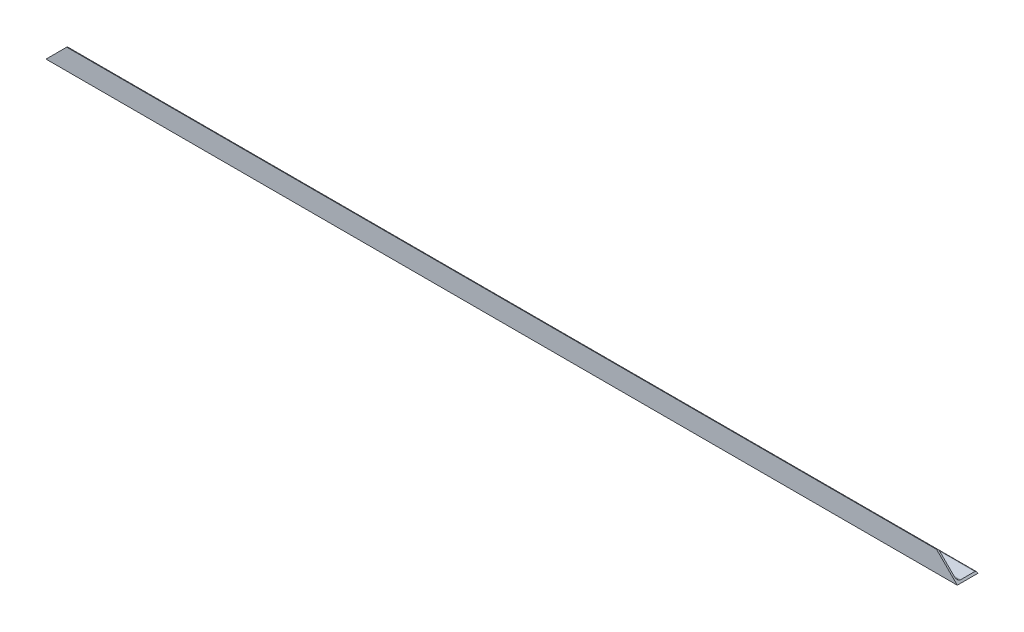
ISO-10303-21;
HEADER;
FILE_DESCRIPTION(('STEP AP214'),'2;1');
FILE_NAME('part.step','',(''),(''),'','','');
FILE_SCHEMA(('AUTOMOTIVE_DESIGN { 1 0 10303 214 1 1 1 1 }'));
ENDSEC;
DATA;
#1=APPLICATION_CONTEXT('core data for automotive mechanical design processes');
#2=APPLICATION_PROTOCOL_DEFINITION('international standard','automotive_design',2000,#1);
#3=PRODUCT_CONTEXT('',#1,'mechanical');
#4=PRODUCT('Part','Part','',(#3));
#5=PRODUCT_RELATED_PRODUCT_CATEGORY('part','',(#4));
#6=PRODUCT_DEFINITION_FORMATION('','',#4);
#7=PRODUCT_DEFINITION_CONTEXT('part definition',#1,'design');
#8=PRODUCT_DEFINITION('design','',#6,#7);
#9=PRODUCT_DEFINITION_SHAPE('','',#8);
#10=(LENGTH_UNIT() NAMED_UNIT(*) SI_UNIT(.MILLI.,.METRE.));
#11=(NAMED_UNIT(*) PLANE_ANGLE_UNIT() SI_UNIT($,.RADIAN.));
#12=(NAMED_UNIT(*) SI_UNIT($,.STERADIAN.) SOLID_ANGLE_UNIT());
#13=UNCERTAINTY_MEASURE_WITH_UNIT(LENGTH_MEASURE(1.E-05),#10,'distance_accuracy_value','');
#14=(GEOMETRIC_REPRESENTATION_CONTEXT(3) GLOBAL_UNCERTAINTY_ASSIGNED_CONTEXT((#13)) GLOBAL_UNIT_ASSIGNED_CONTEXT((#10,
#11,#12)) REPRESENTATION_CONTEXT('',''));
#15=CARTESIAN_POINT('',(0.,0.,0.));
#16=DIRECTION('',(0.,0.,1.));
#17=DIRECTION('',(1.,0.,0.));
#18=AXIS2_PLACEMENT_3D('',#15,#16,#17);
#19=CARTESIAN_POINT('',(1760.,0.,-40.));
#20=DIRECTION('',(0.,1.,0.));
#21=DIRECTION('',(0.,0.,1.));
#22=AXIS2_PLACEMENT_3D('',#19,#20,#21);
#23=PLANE('',#22);
#24=DIRECTION('',(0.,0.,-1.));
#25=VECTOR('',#24,1.);
#26=CARTESIAN_POINT('',(0.,0.,-40.));
#27=LINE('',#26,#25);
#28=CARTESIAN_POINT('',(0.,0.,0.));
#29=VERTEX_POINT('',#28);
#30=CARTESIAN_POINT('',(0.,0.,-40.));
#31=VERTEX_POINT('',#30);
#32=EDGE_CURVE('E113',#29,#31,#27,.T.);
#33=ORIENTED_EDGE('',*,*,#32,.T.);
#34=DIRECTION('',(-1.,0.,0.));
#35=VECTOR('',#34,1.);
#36=CARTESIAN_POINT('',(1760.,0.,-40.));
#37=LINE('',#36,#35);
#38=CARTESIAN_POINT('',(1760.,0.,-40.));
#39=VERTEX_POINT('',#38);
#40=EDGE_CURVE('E13',#39,#31,#37,.T.);
#41=ORIENTED_EDGE('',*,*,#40,.F.);
#42=DIRECTION('',(0.,0.,-1.));
#43=VECTOR('',#42,1.);
#44=CARTESIAN_POINT('',(1760.,0.,-40.));
#45=LINE('',#44,#43);
#46=CARTESIAN_POINT('',(1760.,0.,0.));
#47=VERTEX_POINT('',#46);
#48=EDGE_CURVE('E123',#47,#39,#45,.T.);
#49=ORIENTED_EDGE('',*,*,#48,.F.);
#50=DIRECTION('',(-1.,0.,0.));
#51=VECTOR('',#50,1.);
#52=CARTESIAN_POINT('',(1760.,0.,0.));
#53=LINE('',#52,#51);
#54=EDGE_CURVE('E129',#47,#29,#53,.T.);
#55=ORIENTED_EDGE('',*,*,#54,.T.);
#56=EDGE_LOOP('',(#33,#41,#49,#55));
#57=FACE_BOUND('',#56,.T.);
#58=ADVANCED_FACE('F60',(#57),#23,.F.);
#59=CARTESIAN_POINT('',(1760.,0.,-37.));
#60=DIRECTION('',(-1.,0.,0.));
#61=DIRECTION('',(0.,0.,1.));
#62=AXIS2_PLACEMENT_3D('',#59,#60,#61);
#63=CYLINDRICAL_SURFACE('',#62,3.);
#64=ORIENTED_EDGE('',*,*,#40,.T.);
#65=CARTESIAN_POINT('',(0.,0.,-37.));
#66=DIRECTION('',(0.707106781186548,-0.707106781186548,0.));
#67=DIRECTION('',(-0.707106781186548,-0.707106781186548,0.));
#68=AXIS2_PLACEMENT_3D('',#65,#66,#67);
#69=ELLIPSE('',#68,4.24264068711928,3.);
#70=CARTESIAN_POINT('',(2.99999999999989,3.,-37.));
#71=VERTEX_POINT('',#70);
#72=EDGE_CURVE('E119',#31,#71,#69,.T.);
#73=ORIENTED_EDGE('',*,*,#72,.T.);
#74=DIRECTION('',(-1.,0.,0.));
#75=VECTOR('',#74,1.);
#76=CARTESIAN_POINT('',(1760.,3.,-37.));
#77=LINE('',#76,#75);
#78=CARTESIAN_POINT('',(1757.,3.,-37.));
#79=VERTEX_POINT('',#78);
#80=EDGE_CURVE('E68',#79,#71,#77,.T.);
#81=ORIENTED_EDGE('',*,*,#80,.F.);
#82=CARTESIAN_POINT('',(1760.,0.,-37.));
#83=DIRECTION('',(-0.707106781186547,-0.707106781186548,0.));
#84=DIRECTION('',(-0.707106781186548,0.707106781186547,0.));
#85=AXIS2_PLACEMENT_3D('',#82,#83,#84);
#86=ELLIPSE('',#85,4.24264068711928,3.);
#87=EDGE_CURVE('E124',#79,#39,#86,.T.);
#88=ORIENTED_EDGE('',*,*,#87,.T.);
#89=EDGE_LOOP('',(#64,#73,#81,#88));
#90=FACE_BOUND('',#89,.T.);
#91=ADVANCED_FACE('F158',(#90),#63,.T.);
#92=CARTESIAN_POINT('',(1760.,3.,-9.));
#93=DIRECTION('',(0.,-1.,0.));
#94=DIRECTION('',(0.,0.,-1.));
#95=AXIS2_PLACEMENT_3D('',#92,#93,#94);
#96=PLANE('',#95);
#97=ORIENTED_EDGE('',*,*,#80,.T.);
#98=DIRECTION('',(0.,0.,1.));
#99=VECTOR('',#98,1.);
#100=CARTESIAN_POINT('',(2.99999999999989,3.,-9.));
#101=LINE('',#100,#99);
#102=CARTESIAN_POINT('',(3.00000000000011,3.,-9.00000000000001));
#103=VERTEX_POINT('',#102);
#104=EDGE_CURVE('E154',#71,#103,#101,.T.);
#105=ORIENTED_EDGE('',*,*,#104,.T.);
#106=DIRECTION('',(-1.,0.,0.));
#107=VECTOR('',#106,1.);
#108=CARTESIAN_POINT('',(1760.,3.,-9.00000000000001));
#109=LINE('',#108,#107);
#110=CARTESIAN_POINT('',(1757.,3.,-9.00000000000001));
#111=VERTEX_POINT('',#110);
#112=EDGE_CURVE('E145',#111,#103,#109,.T.);
#113=ORIENTED_EDGE('',*,*,#112,.F.);
#114=DIRECTION('',(0.,0.,-1.));
#115=VECTOR('',#114,1.);
#116=CARTESIAN_POINT('',(1757.,3.,-9.));
#117=LINE('',#116,#115);
#118=EDGE_CURVE('E155',#111,#79,#117,.T.);
#119=ORIENTED_EDGE('',*,*,#118,.T.);
#120=EDGE_LOOP('',(#97,#105,#113,#119));
#121=FACE_BOUND('',#120,.T.);
#122=ADVANCED_FACE('F152',(#121),#96,.F.);
#123=CARTESIAN_POINT('',(1760.,9.,-9.));
#124=DIRECTION('',(-1.,0.,0.));
#125=DIRECTION('',(0.,0.,1.));
#126=AXIS2_PLACEMENT_3D('',#123,#124,#125);
#127=CYLINDRICAL_SURFACE('',#126,6.);
#128=ORIENTED_EDGE('',*,*,#112,.T.);
#129=CARTESIAN_POINT('',(9.00000000000012,9.,-9.));
#130=DIRECTION('',(0.707106781186548,-0.707106781186548,0.));
#131=DIRECTION('',(-0.707106781186548,-0.707106781186548,0.));
#132=AXIS2_PLACEMENT_3D('',#129,#130,#131);
#133=ELLIPSE('',#132,8.48528137423857,6.);
#134=CARTESIAN_POINT('',(8.9999999999999,9.00000000000001,-3.));
#135=VERTEX_POINT('',#134);
#136=EDGE_CURVE('E164',#103,#135,#133,.F.);
#137=ORIENTED_EDGE('',*,*,#136,.T.);
#138=DIRECTION('',(-1.,0.,0.));
#139=VECTOR('',#138,1.);
#140=CARTESIAN_POINT('',(1760.,9.,-3.));
#141=LINE('',#140,#139);
#142=CARTESIAN_POINT('',(1751.,9.,-3.));
#143=VERTEX_POINT('',#142);
#144=EDGE_CURVE('E142',#143,#135,#141,.T.);
#145=ORIENTED_EDGE('',*,*,#144,.F.);
#146=CARTESIAN_POINT('',(1751.,9.,-9.));
#147=DIRECTION('',(-0.707106781186547,-0.707106781186548,0.));
#148=DIRECTION('',(-0.707106781186548,0.707106781186547,0.));
#149=AXIS2_PLACEMENT_3D('',#146,#147,#148);
#150=ELLIPSE('',#149,8.48528137423858,6.);
#151=EDGE_CURVE('E170',#143,#111,#150,.F.);
#152=ORIENTED_EDGE('',*,*,#151,.T.);
#153=EDGE_LOOP('',(#128,#137,#145,#152));
#154=FACE_BOUND('',#153,.T.);
#155=ADVANCED_FACE('F176',(#154),#127,.F.);
#156=CARTESIAN_POINT('',(1760.,37.,-3.));
#157=DIRECTION('',(0.,0.,1.));
#158=DIRECTION('',(1.,0.,0.));
#159=AXIS2_PLACEMENT_3D('',#156,#157,#158);
#160=PLANE('',#159);
#161=ORIENTED_EDGE('',*,*,#144,.T.);
#162=DIRECTION('',(0.707106781186548,0.707106781186548,0.));
#163=VECTOR('',#162,1.);
#164=CARTESIAN_POINT('',(898.5,898.5,-3.));
#165=LINE('',#164,#163);
#166=CARTESIAN_POINT('',(36.9999999999999,37.,-3.));
#167=VERTEX_POINT('',#166);
#168=EDGE_CURVE('E183',#135,#167,#165,.T.);
#169=ORIENTED_EDGE('',*,*,#168,.T.);
#170=DIRECTION('',(-1.,0.,0.));
#171=VECTOR('',#170,1.);
#172=CARTESIAN_POINT('',(1760.,37.,-3.));
#173=LINE('',#172,#171);
#174=CARTESIAN_POINT('',(1723.,37.,-3.));
#175=VERTEX_POINT('',#174);
#176=EDGE_CURVE('E136',#175,#167,#173,.T.);
#177=ORIENTED_EDGE('',*,*,#176,.F.);
#178=DIRECTION('',(0.707106781186548,-0.707106781186547,0.));
#179=VECTOR('',#178,1.);
#180=CARTESIAN_POINT('',(1741.5,18.5,-3.));
#181=LINE('',#180,#179);
#182=EDGE_CURVE('E162',#175,#143,#181,.T.);
#183=ORIENTED_EDGE('',*,*,#182,.T.);
#184=EDGE_LOOP('',(#161,#169,#177,#183));
#185=FACE_BOUND('',#184,.T.);
#186=ADVANCED_FACE('F181',(#185),#160,.F.);
#187=CARTESIAN_POINT('',(1760.,37.,0.));
#188=DIRECTION('',(-1.,0.,0.));
#189=DIRECTION('',(0.,0.,1.));
#190=AXIS2_PLACEMENT_3D('',#187,#188,#189);
#191=CYLINDRICAL_SURFACE('',#190,3.);
#192=ORIENTED_EDGE('',*,*,#176,.T.);
#193=CARTESIAN_POINT('',(36.9999999999999,37.,0.));
#194=DIRECTION('',(0.707106781186548,-0.707106781186548,0.));
#195=DIRECTION('',(-0.707106781186548,-0.707106781186548,0.));
#196=AXIS2_PLACEMENT_3D('',#193,#194,#195);
#197=ELLIPSE('',#196,4.24264068711929,3.);
#198=CARTESIAN_POINT('',(40.,40.,0.));
#199=VERTEX_POINT('',#198);
#200=EDGE_CURVE('E133',#167,#199,#197,.T.);
#201=ORIENTED_EDGE('',*,*,#200,.T.);
#202=DIRECTION('',(-1.,0.,0.));
#203=VECTOR('',#202,1.);
#204=CARTESIAN_POINT('',(1760.,40.,0.));
#205=LINE('',#204,#203);
#206=CARTESIAN_POINT('',(1720.,40.,0.));
#207=VERTEX_POINT('',#206);
#208=EDGE_CURVE('E132',#207,#199,#205,.T.);
#209=ORIENTED_EDGE('',*,*,#208,.F.);
#210=CARTESIAN_POINT('',(1723.,37.,0.));
#211=DIRECTION('',(-0.707106781186547,-0.707106781186548,0.));
#212=DIRECTION('',(-0.707106781186548,0.707106781186547,0.));
#213=AXIS2_PLACEMENT_3D('',#210,#211,#212);
#214=ELLIPSE('',#213,4.24264068711929,3.);
#215=EDGE_CURVE('E159',#207,#175,#214,.T.);
#216=ORIENTED_EDGE('',*,*,#215,.T.);
#217=EDGE_LOOP('',(#192,#201,#209,#216));
#218=FACE_BOUND('',#217,.T.);
#219=ADVANCED_FACE('F185',(#218),#191,.T.);
#220=CARTESIAN_POINT('',(1760.,40.,0.));
#221=DIRECTION('',(0.,0.,-1.));
#222=DIRECTION('',(-1.,0.,0.));
#223=AXIS2_PLACEMENT_3D('',#220,#221,#222);
#224=PLANE('',#223);
#225=ORIENTED_EDGE('',*,*,#208,.T.);
#226=DIRECTION('',(0.707106781186548,0.707106781186548,0.));
#227=VECTOR('',#226,1.);
#228=CARTESIAN_POINT('',(40.,40.,0.));
#229=LINE('',#228,#227);
#230=EDGE_CURVE('E116',#29,#199,#229,.T.);
#231=ORIENTED_EDGE('',*,*,#230,.F.);
#232=ORIENTED_EDGE('',*,*,#54,.F.);
#233=DIRECTION('',(0.707106781186548,-0.707106781186547,0.));
#234=VECTOR('',#233,1.);
#235=CARTESIAN_POINT('',(1720.,40.,0.));
#236=LINE('',#235,#234);
#237=EDGE_CURVE('E74',#207,#47,#236,.T.);
#238=ORIENTED_EDGE('',*,*,#237,.F.);
#239=EDGE_LOOP('',(#225,#231,#232,#238));
#240=FACE_BOUND('',#239,.T.);
#241=ADVANCED_FACE('F128',(#240),#224,.F.);
#242=CARTESIAN_POINT('',(40.,40.,-40.));
#243=DIRECTION('',(0.707106781186548,-0.707106781186548,0.));
#244=DIRECTION('',(0.707106781186548,0.707106781186548,0.));
#245=AXIS2_PLACEMENT_3D('',#242,#243,#244);
#246=PLANE('',#245);
#247=ORIENTED_EDGE('',*,*,#32,.F.);
#248=ORIENTED_EDGE('',*,*,#230,.T.);
#249=ORIENTED_EDGE('',*,*,#200,.F.);
#250=ORIENTED_EDGE('',*,*,#168,.F.);
#251=ORIENTED_EDGE('',*,*,#136,.F.);
#252=ORIENTED_EDGE('',*,*,#104,.F.);
#253=ORIENTED_EDGE('',*,*,#72,.F.);
#254=EDGE_LOOP('',(#247,#248,#249,#250,#251,#252,#253));
#255=FACE_BOUND('',#254,.T.);
#256=ADVANCED_FACE('F115',(#255),#246,.F.);
#257=CARTESIAN_POINT('',(1720.,40.,-40.));
#258=DIRECTION('',(-0.707106781186547,-0.707106781186548,0.));
#259=DIRECTION('',(0.707106781186548,-0.707106781186547,0.));
#260=AXIS2_PLACEMENT_3D('',#257,#258,#259);
#261=PLANE('',#260);
#262=ORIENTED_EDGE('',*,*,#118,.F.);
#263=ORIENTED_EDGE('',*,*,#151,.F.);
#264=ORIENTED_EDGE('',*,*,#182,.F.);
#265=ORIENTED_EDGE('',*,*,#215,.F.);
#266=ORIENTED_EDGE('',*,*,#237,.T.);
#267=ORIENTED_EDGE('',*,*,#48,.T.);
#268=ORIENTED_EDGE('',*,*,#87,.F.);
#269=EDGE_LOOP('',(#262,#263,#264,#265,#266,#267,#268));
#270=FACE_BOUND('',#269,.T.);
#271=ADVANCED_FACE('F178',(#270),#261,.F.);
#272=CLOSED_SHELL('',(#58,#91,#122,#155,#186,#219,#241,#256,#271));
#273=MANIFOLD_SOLID_BREP('B2',#272);
#274=ADVANCED_BREP_SHAPE_REPRESENTATION('',(#18,#273),#14);
#275=SHAPE_DEFINITION_REPRESENTATION(#9,#274);
ENDSEC;
END-ISO-10303-21;
